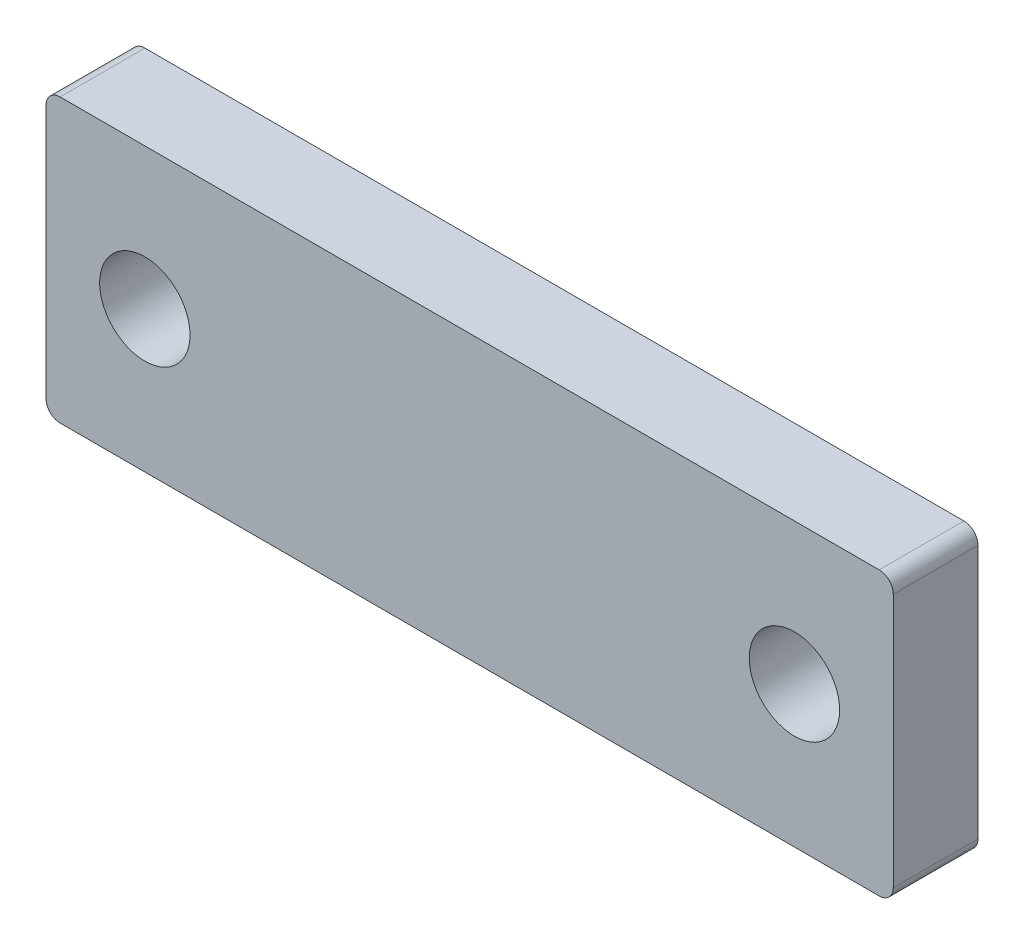
ISO-10303-21;
HEADER;
FILE_DESCRIPTION(('STEP AP214'),'2;1');
FILE_NAME('part.step','',(''),(''),'','','');
FILE_SCHEMA(('AUTOMOTIVE_DESIGN { 1 0 10303 214 1 1 1 1 }'));
ENDSEC;
DATA;
#1=APPLICATION_CONTEXT('core data for automotive mechanical design processes');
#2=APPLICATION_PROTOCOL_DEFINITION('international standard','automotive_design',2000,#1);
#3=PRODUCT_CONTEXT('',#1,'mechanical');
#4=PRODUCT('Part','Part','',(#3));
#5=PRODUCT_RELATED_PRODUCT_CATEGORY('part','',(#4));
#6=PRODUCT_DEFINITION_FORMATION('','',#4);
#7=PRODUCT_DEFINITION_CONTEXT('part definition',#1,'design');
#8=PRODUCT_DEFINITION('design','',#6,#7);
#9=PRODUCT_DEFINITION_SHAPE('','',#8);
#10=(LENGTH_UNIT() NAMED_UNIT(*) SI_UNIT(.MILLI.,.METRE.));
#11=(NAMED_UNIT(*) PLANE_ANGLE_UNIT() SI_UNIT($,.RADIAN.));
#12=(NAMED_UNIT(*) SI_UNIT($,.STERADIAN.) SOLID_ANGLE_UNIT());
#13=UNCERTAINTY_MEASURE_WITH_UNIT(LENGTH_MEASURE(1.E-05),#10,'distance_accuracy_value','');
#14=(GEOMETRIC_REPRESENTATION_CONTEXT(3) GLOBAL_UNCERTAINTY_ASSIGNED_CONTEXT((#13)) GLOBAL_UNIT_ASSIGNED_CONTEXT((#10,
#11,#12)) REPRESENTATION_CONTEXT('',''));
#15=CARTESIAN_POINT('',(0.,0.,0.));
#16=DIRECTION('',(0.,0.,1.));
#17=DIRECTION('',(1.,0.,0.));
#18=AXIS2_PLACEMENT_3D('',#15,#16,#17);
#19=CARTESIAN_POINT('',(-15.,-5.,3.));
#20=DIRECTION('',(1.,0.,0.));
#21=DIRECTION('',(0.,1.,0.));
#22=AXIS2_PLACEMENT_3D('',#19,#20,#21);
#23=PLANE('',#22);
#24=DIRECTION('',(0.,-1.,0.));
#25=VECTOR('',#24,1.);
#26=CARTESIAN_POINT('',(-15.,-5.,0.));
#27=LINE('',#26,#25);
#28=CARTESIAN_POINT('',(-15.,4.5,0.));
#29=VERTEX_POINT('',#28);
#30=CARTESIAN_POINT('',(-15.,-4.5,0.));
#31=VERTEX_POINT('',#30);
#32=EDGE_CURVE('E161',#29,#31,#27,.T.);
#33=ORIENTED_EDGE('',*,*,#32,.T.);
#34=DIRECTION('',(0.,0.,-1.));
#35=VECTOR('',#34,1.);
#36=CARTESIAN_POINT('',(-15.,-4.5,3.));
#37=LINE('',#36,#35);
#38=CARTESIAN_POINT('',(-15.,-4.5,3.));
#39=VERTEX_POINT('',#38);
#40=EDGE_CURVE('E11',#31,#39,#37,.F.);
#41=ORIENTED_EDGE('',*,*,#40,.T.);
#42=DIRECTION('',(0.,-1.,0.));
#43=VECTOR('',#42,1.);
#44=CARTESIAN_POINT('',(-15.,-5.,3.));
#45=LINE('',#44,#43);
#46=CARTESIAN_POINT('',(-15.,4.5,3.));
#47=VERTEX_POINT('',#46);
#48=EDGE_CURVE('E129',#47,#39,#45,.T.);
#49=ORIENTED_EDGE('',*,*,#48,.F.);
#50=DIRECTION('',(0.,0.,-1.));
#51=VECTOR('',#50,1.);
#52=CARTESIAN_POINT('',(-15.,4.5,3.));
#53=LINE('',#52,#51);
#54=EDGE_CURVE('E45',#47,#29,#53,.T.);
#55=ORIENTED_EDGE('',*,*,#54,.T.);
#56=EDGE_LOOP('',(#33,#41,#49,#55));
#57=FACE_BOUND('',#56,.T.);
#58=ADVANCED_FACE('F37',(#57),#23,.F.);
#59=CARTESIAN_POINT('',(15.,-5.,3.));
#60=DIRECTION('',(0.,1.,0.));
#61=DIRECTION('',(-1.,0.,0.));
#62=AXIS2_PLACEMENT_3D('',#59,#60,#61);
#63=PLANE('',#62);
#64=DIRECTION('',(1.,0.,0.));
#65=VECTOR('',#64,1.);
#66=CARTESIAN_POINT('',(15.,-5.,0.));
#67=LINE('',#66,#65);
#68=CARTESIAN_POINT('',(-14.5,-5.,0.));
#69=VERTEX_POINT('',#68);
#70=CARTESIAN_POINT('',(14.5,-5.,0.));
#71=VERTEX_POINT('',#70);
#72=EDGE_CURVE('E134',#69,#71,#67,.T.);
#73=ORIENTED_EDGE('',*,*,#72,.T.);
#74=DIRECTION('',(0.,0.,-1.));
#75=VECTOR('',#74,1.);
#76=CARTESIAN_POINT('',(14.5,-5.,3.));
#77=LINE('',#76,#75);
#78=CARTESIAN_POINT('',(14.5,-5.,3.));
#79=VERTEX_POINT('',#78);
#80=EDGE_CURVE('E52',#71,#79,#77,.F.);
#81=ORIENTED_EDGE('',*,*,#80,.T.);
#82=DIRECTION('',(1.,0.,0.));
#83=VECTOR('',#82,1.);
#84=CARTESIAN_POINT('',(15.,-5.,3.));
#85=LINE('',#84,#83);
#86=CARTESIAN_POINT('',(-14.5,-5.,3.));
#87=VERTEX_POINT('',#86);
#88=EDGE_CURVE('E132',#87,#79,#85,.T.);
#89=ORIENTED_EDGE('',*,*,#88,.F.);
#90=DIRECTION('',(0.,0.,-1.));
#91=VECTOR('',#90,1.);
#92=CARTESIAN_POINT('',(-14.5,-5.,3.));
#93=LINE('',#92,#91);
#94=EDGE_CURVE('E153',#87,#69,#93,.T.);
#95=ORIENTED_EDGE('',*,*,#94,.T.);
#96=EDGE_LOOP('',(#73,#81,#89,#95));
#97=FACE_BOUND('',#96,.T.);
#98=ADVANCED_FACE('F200',(#97),#63,.F.);
#99=CARTESIAN_POINT('',(15.,-5.,3.));
#100=DIRECTION('',(-1.,0.,0.));
#101=DIRECTION('',(0.,0.,1.));
#102=AXIS2_PLACEMENT_3D('',#99,#100,#101);
#103=PLANE('',#102);
#104=DIRECTION('',(0.,1.,0.));
#105=VECTOR('',#104,1.);
#106=CARTESIAN_POINT('',(15.,-5.,0.));
#107=LINE('',#106,#105);
#108=CARTESIAN_POINT('',(15.,-4.5,0.));
#109=VERTEX_POINT('',#108);
#110=CARTESIAN_POINT('',(15.,4.5,0.));
#111=VERTEX_POINT('',#110);
#112=EDGE_CURVE('E130',#109,#111,#107,.T.);
#113=ORIENTED_EDGE('',*,*,#112,.T.);
#114=DIRECTION('',(0.,0.,-1.));
#115=VECTOR('',#114,1.);
#116=CARTESIAN_POINT('',(15.,4.5,3.));
#117=LINE('',#116,#115);
#118=CARTESIAN_POINT('',(15.,4.5,3.));
#119=VERTEX_POINT('',#118);
#120=EDGE_CURVE('E108',#111,#119,#117,.F.);
#121=ORIENTED_EDGE('',*,*,#120,.T.);
#122=DIRECTION('',(0.,1.,0.));
#123=VECTOR('',#122,1.);
#124=CARTESIAN_POINT('',(15.,-5.,3.));
#125=LINE('',#124,#123);
#126=CARTESIAN_POINT('',(15.,-4.5,3.));
#127=VERTEX_POINT('',#126);
#128=EDGE_CURVE('E173',#127,#119,#125,.T.);
#129=ORIENTED_EDGE('',*,*,#128,.F.);
#130=DIRECTION('',(0.,0.,-1.));
#131=VECTOR('',#130,1.);
#132=CARTESIAN_POINT('',(15.,-4.5,3.));
#133=LINE('',#132,#131);
#134=EDGE_CURVE('E113',#127,#109,#133,.T.);
#135=ORIENTED_EDGE('',*,*,#134,.T.);
#136=EDGE_LOOP('',(#113,#121,#129,#135));
#137=FACE_BOUND('',#136,.T.);
#138=ADVANCED_FACE('F197',(#137),#103,.F.);
#139=CARTESIAN_POINT('',(15.,5.,3.));
#140=DIRECTION('',(0.,-1.,0.));
#141=DIRECTION('',(1.,0.,0.));
#142=AXIS2_PLACEMENT_3D('',#139,#140,#141);
#143=PLANE('',#142);
#144=DIRECTION('',(-1.,0.,0.));
#145=VECTOR('',#144,1.);
#146=CARTESIAN_POINT('',(15.,5.,3.));
#147=LINE('',#146,#145);
#148=CARTESIAN_POINT('',(14.5,5.,3.));
#149=VERTEX_POINT('',#148);
#150=CARTESIAN_POINT('',(-14.5,5.,3.));
#151=VERTEX_POINT('',#150);
#152=EDGE_CURVE('E123',#149,#151,#147,.T.);
#153=ORIENTED_EDGE('',*,*,#152,.F.);
#154=DIRECTION('',(0.,0.,-1.));
#155=VECTOR('',#154,1.);
#156=CARTESIAN_POINT('',(14.5,5.,3.));
#157=LINE('',#156,#155);
#158=CARTESIAN_POINT('',(14.5,5.,0.));
#159=VERTEX_POINT('',#158);
#160=EDGE_CURVE('E107',#149,#159,#157,.T.);
#161=ORIENTED_EDGE('',*,*,#160,.T.);
#162=DIRECTION('',(-1.,0.,0.));
#163=VECTOR('',#162,1.);
#164=CARTESIAN_POINT('',(15.,5.,0.));
#165=LINE('',#164,#163);
#166=CARTESIAN_POINT('',(-14.5,5.,0.));
#167=VERTEX_POINT('',#166);
#168=EDGE_CURVE('E120',#159,#167,#165,.T.);
#169=ORIENTED_EDGE('',*,*,#168,.T.);
#170=DIRECTION('',(0.,0.,-1.));
#171=VECTOR('',#170,1.);
#172=CARTESIAN_POINT('',(-14.5,5.,3.));
#173=LINE('',#172,#171);
#174=EDGE_CURVE('E125',#167,#151,#173,.F.);
#175=ORIENTED_EDGE('',*,*,#174,.T.);
#176=EDGE_LOOP('',(#153,#161,#169,#175));
#177=FACE_BOUND('',#176,.T.);
#178=ADVANCED_FACE('F119',(#177),#143,.F.);
#179=CARTESIAN_POINT('',(0.,0.,3.));
#180=DIRECTION('',(0.,0.,1.));
#181=DIRECTION('',(1.,0.,0.));
#182=AXIS2_PLACEMENT_3D('',#179,#180,#181);
#183=PLANE('',#182);
#184=CARTESIAN_POINT('',(-11.5,0.,3.));
#185=DIRECTION('',(0.,0.,1.));
#186=DIRECTION('',(1.,0.,0.));
#187=AXIS2_PLACEMENT_3D('',#184,#185,#186);
#188=CIRCLE('',#187,1.6);
#189=CARTESIAN_POINT('',(-9.9,0.,3.));
#190=VERTEX_POINT('',#189);
#191=EDGE_CURVE('E182',#190,#190,#188,.T.);
#192=ORIENTED_EDGE('',*,*,#191,.F.);
#193=EDGE_LOOP('',(#192));
#194=FACE_BOUND('',#193,.T.);
#195=CARTESIAN_POINT('',(11.5,0.,3.));
#196=DIRECTION('',(0.,0.,1.));
#197=DIRECTION('',(1.,0.,0.));
#198=AXIS2_PLACEMENT_3D('',#195,#196,#197);
#199=CIRCLE('',#198,1.6);
#200=CARTESIAN_POINT('',(13.1,0.,3.));
#201=VERTEX_POINT('',#200);
#202=EDGE_CURVE('E169',#201,#201,#199,.T.);
#203=ORIENTED_EDGE('',*,*,#202,.F.);
#204=EDGE_LOOP('',(#203));
#205=FACE_BOUND('',#204,.T.);
#206=ORIENTED_EDGE('',*,*,#128,.T.);
#207=CARTESIAN_POINT('',(14.5,4.5,3.));
#208=DIRECTION('',(0.,0.,1.));
#209=DIRECTION('',(1.,0.,0.));
#210=AXIS2_PLACEMENT_3D('',#207,#208,#209);
#211=CIRCLE('',#210,0.5);
#212=EDGE_CURVE('E151',#119,#149,#211,.T.);
#213=ORIENTED_EDGE('',*,*,#212,.T.);
#214=ORIENTED_EDGE('',*,*,#152,.T.);
#215=CARTESIAN_POINT('',(-14.5,4.5,3.));
#216=DIRECTION('',(0.,0.,1.));
#217=DIRECTION('',(1.,0.,0.));
#218=AXIS2_PLACEMENT_3D('',#215,#216,#217);
#219=CIRCLE('',#218,0.5);
#220=EDGE_CURVE('E146',#151,#47,#219,.T.);
#221=ORIENTED_EDGE('',*,*,#220,.T.);
#222=ORIENTED_EDGE('',*,*,#48,.T.);
#223=CARTESIAN_POINT('',(-14.5,-4.5,3.));
#224=DIRECTION('',(0.,0.,1.));
#225=DIRECTION('',(1.,0.,0.));
#226=AXIS2_PLACEMENT_3D('',#223,#224,#225);
#227=CIRCLE('',#226,0.5);
#228=EDGE_CURVE('E59',#39,#87,#227,.T.);
#229=ORIENTED_EDGE('',*,*,#228,.T.);
#230=ORIENTED_EDGE('',*,*,#88,.T.);
#231=CARTESIAN_POINT('',(14.5,-4.5,3.));
#232=DIRECTION('',(0.,0.,1.));
#233=DIRECTION('',(1.,0.,0.));
#234=AXIS2_PLACEMENT_3D('',#231,#232,#233);
#235=CIRCLE('',#234,0.5);
#236=EDGE_CURVE('E149',#79,#127,#235,.T.);
#237=ORIENTED_EDGE('',*,*,#236,.T.);
#238=EDGE_LOOP('',(#206,#213,#214,#221,#222,#229,#230,#237));
#239=FACE_BOUND('',#238,.T.);
#240=ADVANCED_FACE('F188',(#194,#205,#239),#183,.T.);
#241=CARTESIAN_POINT('',(0.,0.,0.));
#242=DIRECTION('',(0.,0.,1.));
#243=DIRECTION('',(1.,0.,0.));
#244=AXIS2_PLACEMENT_3D('',#241,#242,#243);
#245=PLANE('',#244);
#246=CARTESIAN_POINT('',(-11.5,0.,0.));
#247=DIRECTION('',(0.,0.,1.));
#248=DIRECTION('',(1.,0.,0.));
#249=AXIS2_PLACEMENT_3D('',#246,#247,#248);
#250=CIRCLE('',#249,1.6);
#251=CARTESIAN_POINT('',(-9.9,0.,0.));
#252=VERTEX_POINT('',#251);
#253=EDGE_CURVE('E179',#252,#252,#250,.T.);
#254=ORIENTED_EDGE('',*,*,#253,.T.);
#255=EDGE_LOOP('',(#254));
#256=FACE_BOUND('',#255,.T.);
#257=CARTESIAN_POINT('',(11.5,0.,0.));
#258=DIRECTION('',(0.,0.,1.));
#259=DIRECTION('',(1.,0.,0.));
#260=AXIS2_PLACEMENT_3D('',#257,#258,#259);
#261=CIRCLE('',#260,1.6);
#262=CARTESIAN_POINT('',(13.1,0.,0.));
#263=VERTEX_POINT('',#262);
#264=EDGE_CURVE('E166',#263,#263,#261,.T.);
#265=ORIENTED_EDGE('',*,*,#264,.T.);
#266=EDGE_LOOP('',(#265));
#267=FACE_BOUND('',#266,.T.);
#268=ORIENTED_EDGE('',*,*,#168,.F.);
#269=CARTESIAN_POINT('',(14.5,4.5,0.));
#270=DIRECTION('',(0.,0.,1.));
#271=DIRECTION('',(1.,0.,0.));
#272=AXIS2_PLACEMENT_3D('',#269,#270,#271);
#273=CIRCLE('',#272,0.5);
#274=EDGE_CURVE('E103',#159,#111,#273,.F.);
#275=ORIENTED_EDGE('',*,*,#274,.T.);
#276=ORIENTED_EDGE('',*,*,#112,.F.);
#277=CARTESIAN_POINT('',(14.5,-4.5,0.));
#278=DIRECTION('',(0.,0.,1.));
#279=DIRECTION('',(1.,0.,0.));
#280=AXIS2_PLACEMENT_3D('',#277,#278,#279);
#281=CIRCLE('',#280,0.5);
#282=EDGE_CURVE('E114',#109,#71,#281,.F.);
#283=ORIENTED_EDGE('',*,*,#282,.T.);
#284=ORIENTED_EDGE('',*,*,#72,.F.);
#285=CARTESIAN_POINT('',(-14.5,-4.5,0.));
#286=DIRECTION('',(0.,0.,1.));
#287=DIRECTION('',(1.,0.,0.));
#288=AXIS2_PLACEMENT_3D('',#285,#286,#287);
#289=CIRCLE('',#288,0.5);
#290=EDGE_CURVE('E140',#69,#31,#289,.F.);
#291=ORIENTED_EDGE('',*,*,#290,.T.);
#292=ORIENTED_EDGE('',*,*,#32,.F.);
#293=CARTESIAN_POINT('',(-14.5,4.5,0.));
#294=DIRECTION('',(0.,0.,1.));
#295=DIRECTION('',(1.,0.,0.));
#296=AXIS2_PLACEMENT_3D('',#293,#294,#295);
#297=CIRCLE('',#296,0.5);
#298=EDGE_CURVE('E124',#29,#167,#297,.F.);
#299=ORIENTED_EDGE('',*,*,#298,.T.);
#300=EDGE_LOOP('',(#268,#275,#276,#283,#284,#291,#292,#299));
#301=FACE_BOUND('',#300,.T.);
#302=ADVANCED_FACE('F127',(#256,#267,#301),#245,.F.);
#303=CARTESIAN_POINT('',(11.5,0.,3.));
#304=DIRECTION('',(0.,0.,1.));
#305=DIRECTION('',(1.,0.,0.));
#306=AXIS2_PLACEMENT_3D('',#303,#304,#305);
#307=CYLINDRICAL_SURFACE('',#306,1.6);
#308=ORIENTED_EDGE('',*,*,#264,.F.);
#309=EDGE_LOOP('',(#308));
#310=FACE_BOUND('',#309,.T.);
#311=ORIENTED_EDGE('',*,*,#202,.T.);
#312=EDGE_LOOP('',(#311));
#313=FACE_BOUND('',#312,.T.);
#314=ADVANCED_FACE('F248',(#310,#313),#307,.F.);
#315=CARTESIAN_POINT('',(-11.5,0.,3.));
#316=DIRECTION('',(0.,0.,1.));
#317=DIRECTION('',(1.,0.,0.));
#318=AXIS2_PLACEMENT_3D('',#315,#316,#317);
#319=CYLINDRICAL_SURFACE('',#318,1.6);
#320=ORIENTED_EDGE('',*,*,#253,.F.);
#321=EDGE_LOOP('',(#320));
#322=FACE_BOUND('',#321,.T.);
#323=ORIENTED_EDGE('',*,*,#191,.T.);
#324=EDGE_LOOP('',(#323));
#325=FACE_BOUND('',#324,.T.);
#326=ADVANCED_FACE('F186',(#322,#325),#319,.F.);
#327=CARTESIAN_POINT('',(14.5,4.5,3.));
#328=DIRECTION('',(0.,0.,-1.));
#329=DIRECTION('',(-1.,0.,0.));
#330=AXIS2_PLACEMENT_3D('',#327,#328,#329);
#331=CYLINDRICAL_SURFACE('',#330,0.5);
#332=ORIENTED_EDGE('',*,*,#212,.F.);
#333=ORIENTED_EDGE('',*,*,#120,.F.);
#334=ORIENTED_EDGE('',*,*,#274,.F.);
#335=ORIENTED_EDGE('',*,*,#160,.F.);
#336=EDGE_LOOP('',(#332,#333,#334,#335));
#337=FACE_BOUND('',#336,.T.);
#338=ADVANCED_FACE('F106',(#337),#331,.T.);
#339=CARTESIAN_POINT('',(14.5,-4.5,3.));
#340=DIRECTION('',(0.,0.,-1.));
#341=DIRECTION('',(-1.,0.,0.));
#342=AXIS2_PLACEMENT_3D('',#339,#340,#341);
#343=CYLINDRICAL_SURFACE('',#342,0.5);
#344=ORIENTED_EDGE('',*,*,#236,.F.);
#345=ORIENTED_EDGE('',*,*,#80,.F.);
#346=ORIENTED_EDGE('',*,*,#282,.F.);
#347=ORIENTED_EDGE('',*,*,#134,.F.);
#348=EDGE_LOOP('',(#344,#345,#346,#347));
#349=FACE_BOUND('',#348,.T.);
#350=ADVANCED_FACE('F199',(#349),#343,.T.);
#351=CARTESIAN_POINT('',(-14.5,-4.5,3.));
#352=DIRECTION('',(0.,0.,-1.));
#353=DIRECTION('',(-1.,0.,0.));
#354=AXIS2_PLACEMENT_3D('',#351,#352,#353);
#355=CYLINDRICAL_SURFACE('',#354,0.5);
#356=ORIENTED_EDGE('',*,*,#228,.F.);
#357=ORIENTED_EDGE('',*,*,#40,.F.);
#358=ORIENTED_EDGE('',*,*,#290,.F.);
#359=ORIENTED_EDGE('',*,*,#94,.F.);
#360=EDGE_LOOP('',(#356,#357,#358,#359));
#361=FACE_BOUND('',#360,.T.);
#362=ADVANCED_FACE('F203',(#361),#355,.T.);
#363=CARTESIAN_POINT('',(-14.5,4.5,3.));
#364=DIRECTION('',(0.,0.,-1.));
#365=DIRECTION('',(-1.,0.,0.));
#366=AXIS2_PLACEMENT_3D('',#363,#364,#365);
#367=CYLINDRICAL_SURFACE('',#366,0.5);
#368=ORIENTED_EDGE('',*,*,#220,.F.);
#369=ORIENTED_EDGE('',*,*,#174,.F.);
#370=ORIENTED_EDGE('',*,*,#298,.F.);
#371=ORIENTED_EDGE('',*,*,#54,.F.);
#372=EDGE_LOOP('',(#368,#369,#370,#371));
#373=FACE_BOUND('',#372,.T.);
#374=ADVANCED_FACE('F39',(#373),#367,.T.);
#375=CLOSED_SHELL('',(#58,#98,#138,#178,#240,#302,#314,#326,#338,#350,#362,#374));
#376=MANIFOLD_SOLID_BREP('B2',#375);
#377=ADVANCED_BREP_SHAPE_REPRESENTATION('',(#18,#376),#14);
#378=SHAPE_DEFINITION_REPRESENTATION(#9,#377);
ENDSEC;
END-ISO-10303-21;
